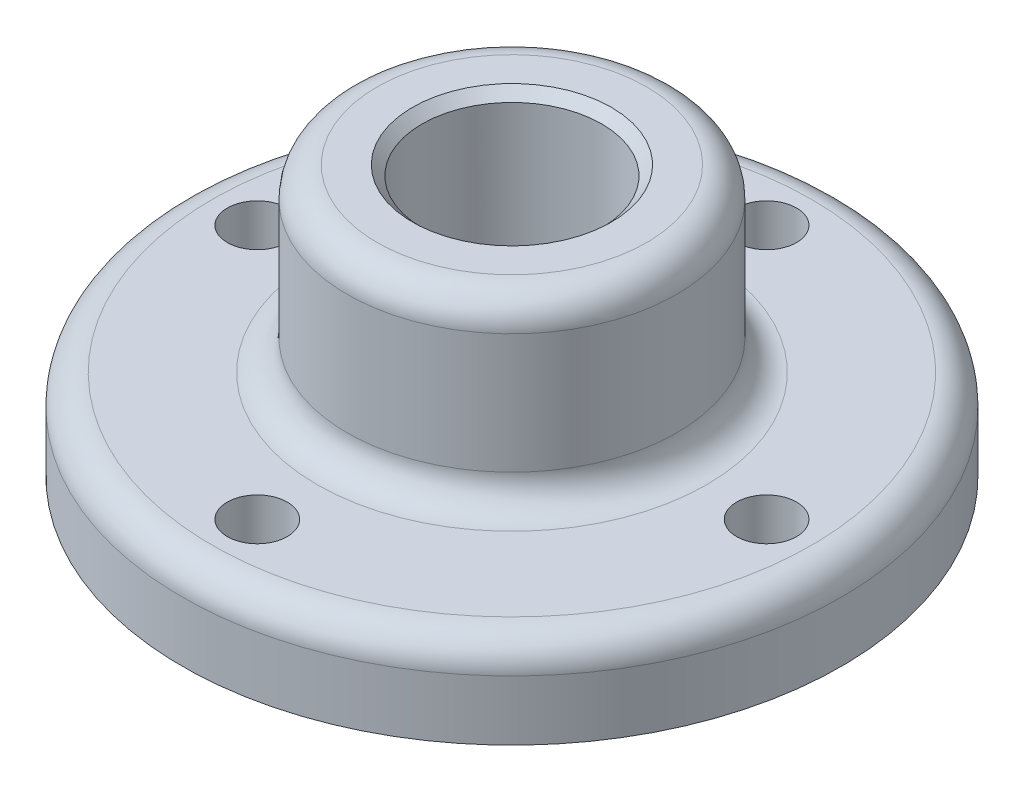
ISO-10303-21;
HEADER;
FILE_DESCRIPTION(('STEP AP214'),'2;1');
FILE_NAME('part.step','',(''),(''),'','','');
FILE_SCHEMA(('AUTOMOTIVE_DESIGN { 1 0 10303 214 1 1 1 1 }'));
ENDSEC;
DATA;
#1=APPLICATION_CONTEXT('core data for automotive mechanical design processes');
#2=APPLICATION_PROTOCOL_DEFINITION('international standard','automotive_design',2000,#1);
#3=PRODUCT_CONTEXT('',#1,'mechanical');
#4=PRODUCT('Part','Part','',(#3));
#5=PRODUCT_RELATED_PRODUCT_CATEGORY('part','',(#4));
#6=PRODUCT_DEFINITION_FORMATION('','',#4);
#7=PRODUCT_DEFINITION_CONTEXT('part definition',#1,'design');
#8=PRODUCT_DEFINITION('design','',#6,#7);
#9=PRODUCT_DEFINITION_SHAPE('','',#8);
#10=(LENGTH_UNIT() NAMED_UNIT(*) SI_UNIT(.MILLI.,.METRE.));
#11=(NAMED_UNIT(*) PLANE_ANGLE_UNIT() SI_UNIT($,.RADIAN.));
#12=(NAMED_UNIT(*) SI_UNIT($,.STERADIAN.) SOLID_ANGLE_UNIT());
#13=UNCERTAINTY_MEASURE_WITH_UNIT(LENGTH_MEASURE(1.E-05),#10,'distance_accuracy_value','');
#14=(GEOMETRIC_REPRESENTATION_CONTEXT(3) GLOBAL_UNCERTAINTY_ASSIGNED_CONTEXT((#13)) GLOBAL_UNIT_ASSIGNED_CONTEXT((#10,
#11,#12)) REPRESENTATION_CONTEXT('',''));
#15=CARTESIAN_POINT('',(0.,0.,0.));
#16=DIRECTION('',(0.,0.,1.));
#17=DIRECTION('',(1.,0.,0.));
#18=AXIS2_PLACEMENT_3D('',#15,#16,#17);
#19=CARTESIAN_POINT('',(0.,38.1,0.));
#20=DIRECTION('',(0.,-1.,0.));
#21=DIRECTION('',(0.,0.,-1.));
#22=AXIS2_PLACEMENT_3D('',#19,#20,#21);
#23=PLANE('',#22);
#24=CARTESIAN_POINT('',(0.,38.1,0.));
#25=DIRECTION('',(0.,-1.,0.));
#26=DIRECTION('',(0.,0.,-1.));
#27=AXIS2_PLACEMENT_3D('',#24,#25,#26);
#28=CIRCLE('',#27,21.082);
#29=CARTESIAN_POINT('',(0.,38.1,-21.082));
#30=VERTEX_POINT('',#29);
#31=EDGE_CURVE('E10',#30,#30,#28,.T.);
#32=ORIENTED_EDGE('',*,*,#31,.T.);
#33=EDGE_LOOP('',(#32));
#34=FACE_BOUND('',#33,.T.);
#35=CARTESIAN_POINT('',(0.,38.1,0.));
#36=DIRECTION('',(0.,-1.,0.));
#37=DIRECTION('',(0.,0.,-1.));
#38=AXIS2_PLACEMENT_3D('',#35,#36,#37);
#39=CIRCLE('',#38,28.575);
#40=CARTESIAN_POINT('',(0.,38.1,-28.575));
#41=VERTEX_POINT('',#40);
#42=EDGE_CURVE('E49',#41,#41,#39,.F.);
#43=ORIENTED_EDGE('',*,*,#42,.T.);
#44=EDGE_LOOP('',(#43));
#45=FACE_BOUND('',#44,.T.);
#46=ADVANCED_FACE('F37',(#34,#45),#23,.F.);
#47=CARTESIAN_POINT('',(0.,-19.05,0.));
#48=DIRECTION('',(0.,-1.,0.));
#49=DIRECTION('',(0.,0.,-1.));
#50=AXIS2_PLACEMENT_3D('',#47,#48,#49);
#51=PLANE('',#50);
#52=CARTESIAN_POINT('',(-53.975,-19.05,1.88452705264058E-13));
#53=DIRECTION('',(0.,1.,0.));
#54=DIRECTION('',(1.,0.,0.));
#55=AXIS2_PLACEMENT_3D('',#52,#53,#54);
#56=CIRCLE('',#55,6.35);
#57=CARTESIAN_POINT('',(-47.625,-19.05,1.66281798762404E-13));
#58=VERTEX_POINT('',#57);
#59=EDGE_CURVE('E80',#58,#58,#56,.T.);
#60=ORIENTED_EDGE('',*,*,#59,.T.);
#61=EDGE_LOOP('',(#60));
#62=FACE_BOUND('',#61,.T.);
#63=CARTESIAN_POINT('',(0.,-19.05,53.975));
#64=DIRECTION('',(0.,1.,0.));
#65=DIRECTION('',(0.,0.,-1.));
#66=AXIS2_PLACEMENT_3D('',#63,#64,#65);
#67=CIRCLE('',#66,6.35);
#68=CARTESIAN_POINT('',(0.,-19.05,47.625));
#69=VERTEX_POINT('',#68);
#70=EDGE_CURVE('E92',#69,#69,#67,.T.);
#71=ORIENTED_EDGE('',*,*,#70,.T.);
#72=EDGE_LOOP('',(#71));
#73=FACE_BOUND('',#72,.T.);
#74=CARTESIAN_POINT('',(53.975,-19.05,-5.65358115792174E-13));
#75=DIRECTION('',(0.,1.,0.));
#76=DIRECTION('',(-1.,0.,0.));
#77=AXIS2_PLACEMENT_3D('',#74,#75,#76);
#78=CIRCLE('',#77,6.35);
#79=CARTESIAN_POINT('',(47.625,-19.05,-4.98845396287213E-13));
#80=VERTEX_POINT('',#79);
#81=EDGE_CURVE('E86',#80,#80,#78,.T.);
#82=ORIENTED_EDGE('',*,*,#81,.T.);
#83=EDGE_LOOP('',(#82));
#84=FACE_BOUND('',#83,.T.);
#85=CARTESIAN_POINT('',(0.,-19.05,-53.975));
#86=DIRECTION('',(0.,1.,0.));
#87=DIRECTION('',(0.,0.,1.));
#88=AXIS2_PLACEMENT_3D('',#85,#86,#87);
#89=CIRCLE('',#88,6.35);
#90=CARTESIAN_POINT('',(0.,-19.05,-47.625));
#91=VERTEX_POINT('',#90);
#92=EDGE_CURVE('E76',#91,#91,#89,.T.);
#93=ORIENTED_EDGE('',*,*,#92,.T.);
#94=EDGE_LOOP('',(#93));
#95=FACE_BOUND('',#94,.T.);
#96=CARTESIAN_POINT('',(0.,-19.05,0.));
#97=DIRECTION('',(0.,1.,0.));
#98=DIRECTION('',(0.,0.,1.));
#99=AXIS2_PLACEMENT_3D('',#96,#97,#98);
#100=CIRCLE('',#99,19.05);
#101=CARTESIAN_POINT('',(0.,-19.05,19.05));
#102=VERTEX_POINT('',#101);
#103=EDGE_CURVE('E73',#102,#102,#100,.T.);
#104=ORIENTED_EDGE('',*,*,#103,.T.);
#105=EDGE_LOOP('',(#104));
#106=FACE_BOUND('',#105,.T.);
#107=CARTESIAN_POINT('',(0.,-19.05,0.));
#108=DIRECTION('',(0.,-1.,0.));
#109=DIRECTION('',(0.,0.,-1.));
#110=AXIS2_PLACEMENT_3D('',#107,#108,#109);
#111=CIRCLE('',#110,69.85);
#112=CARTESIAN_POINT('',(0.,-19.05,-69.85));
#113=VERTEX_POINT('',#112);
#114=EDGE_CURVE('E70',#113,#113,#111,.T.);
#115=ORIENTED_EDGE('',*,*,#114,.T.);
#116=EDGE_LOOP('',(#115));
#117=FACE_BOUND('',#116,.T.);
#118=ADVANCED_FACE('F101',(#62,#73,#84,#95,#106,#117),#51,.T.);
#119=CARTESIAN_POINT('',(0.,38.1,0.));
#120=DIRECTION('',(0.,-1.,0.));
#121=DIRECTION('',(0.,0.,-1.));
#122=AXIS2_PLACEMENT_3D('',#119,#120,#121);
#123=CYLINDRICAL_SURFACE('',#122,69.85);
#124=CARTESIAN_POINT('',(0.,-6.35,0.));
#125=DIRECTION('',(0.,-1.,0.));
#126=DIRECTION('',(0.,0.,-1.));
#127=AXIS2_PLACEMENT_3D('',#124,#125,#126);
#128=CIRCLE('',#127,69.85);
#129=CARTESIAN_POINT('',(0.,-6.35,-69.85));
#130=VERTEX_POINT('',#129);
#131=EDGE_CURVE('E53',#130,#130,#128,.T.);
#132=ORIENTED_EDGE('',*,*,#131,.T.);
#133=EDGE_LOOP('',(#132));
#134=FACE_BOUND('',#133,.T.);
#135=ORIENTED_EDGE('',*,*,#114,.F.);
#136=EDGE_LOOP('',(#135));
#137=FACE_BOUND('',#136,.T.);
#138=ADVANCED_FACE('F116',(#134,#137),#123,.T.);
#139=CARTESIAN_POINT('',(34.925,0.,0.));
#140=DIRECTION('',(0.,-1.,0.));
#141=DIRECTION('',(0.,0.,-1.));
#142=AXIS2_PLACEMENT_3D('',#139,#140,#141);
#143=PLANE('',#142);
#144=CARTESIAN_POINT('',(0.,0.,0.));
#145=DIRECTION('',(0.,-1.,0.));
#146=DIRECTION('',(0.,0.,-1.));
#147=AXIS2_PLACEMENT_3D('',#144,#145,#146);
#148=CIRCLE('',#147,41.275);
#149=CARTESIAN_POINT('',(0.,0.,-41.275));
#150=VERTEX_POINT('',#149);
#151=EDGE_CURVE('E64',#150,#150,#148,.T.);
#152=ORIENTED_EDGE('',*,*,#151,.T.);
#153=EDGE_LOOP('',(#152));
#154=FACE_BOUND('',#153,.T.);
#155=CARTESIAN_POINT('',(0.,0.,0.));
#156=DIRECTION('',(0.,-1.,0.));
#157=DIRECTION('',(0.,0.,-1.));
#158=AXIS2_PLACEMENT_3D('',#155,#156,#157);
#159=CIRCLE('',#158,63.5);
#160=CARTESIAN_POINT('',(0.,0.,-63.5));
#161=VERTEX_POINT('',#160);
#162=EDGE_CURVE('E67',#161,#161,#159,.F.);
#163=ORIENTED_EDGE('',*,*,#162,.T.);
#164=EDGE_LOOP('',(#163));
#165=FACE_BOUND('',#164,.T.);
#166=CARTESIAN_POINT('',(-53.975,0.,1.88452705264058E-13));
#167=DIRECTION('',(0.,1.,0.));
#168=DIRECTION('',(1.,0.,0.));
#169=AXIS2_PLACEMENT_3D('',#166,#167,#168);
#170=CIRCLE('',#169,6.35);
#171=CARTESIAN_POINT('',(-47.625,0.,1.66281798762404E-13));
#172=VERTEX_POINT('',#171);
#173=EDGE_CURVE('E95',#172,#172,#170,.T.);
#174=ORIENTED_EDGE('',*,*,#173,.F.);
#175=EDGE_LOOP('',(#174));
#176=FACE_BOUND('',#175,.T.);
#177=CARTESIAN_POINT('',(0.,0.,53.975));
#178=DIRECTION('',(0.,1.,0.));
#179=DIRECTION('',(0.,0.,-1.));
#180=AXIS2_PLACEMENT_3D('',#177,#178,#179);
#181=CIRCLE('',#180,6.35);
#182=CARTESIAN_POINT('',(0.,0.,47.625));
#183=VERTEX_POINT('',#182);
#184=EDGE_CURVE('E89',#183,#183,#181,.T.);
#185=ORIENTED_EDGE('',*,*,#184,.F.);
#186=EDGE_LOOP('',(#185));
#187=FACE_BOUND('',#186,.T.);
#188=CARTESIAN_POINT('',(53.975,0.,-5.65358115792174E-13));
#189=DIRECTION('',(0.,1.,0.));
#190=DIRECTION('',(-1.,0.,0.));
#191=AXIS2_PLACEMENT_3D('',#188,#189,#190);
#192=CIRCLE('',#191,6.35);
#193=CARTESIAN_POINT('',(47.625,0.,-4.98845396287213E-13));
#194=VERTEX_POINT('',#193);
#195=EDGE_CURVE('E83',#194,#194,#192,.T.);
#196=ORIENTED_EDGE('',*,*,#195,.F.);
#197=EDGE_LOOP('',(#196));
#198=FACE_BOUND('',#197,.T.);
#199=CARTESIAN_POINT('',(0.,0.,-53.975));
#200=DIRECTION('',(0.,1.,0.));
#201=DIRECTION('',(0.,0.,1.));
#202=AXIS2_PLACEMENT_3D('',#199,#200,#201);
#203=CIRCLE('',#202,6.35);
#204=CARTESIAN_POINT('',(0.,0.,-47.625));
#205=VERTEX_POINT('',#204);
#206=EDGE_CURVE('E77',#205,#205,#203,.T.);
#207=ORIENTED_EDGE('',*,*,#206,.F.);
#208=EDGE_LOOP('',(#207));
#209=FACE_BOUND('',#208,.T.);
#210=ADVANCED_FACE('F112',(#154,#165,#176,#187,#198,#209),#143,.F.);
#211=CARTESIAN_POINT('',(0.,38.1,0.));
#212=DIRECTION('',(0.,-1.,0.));
#213=DIRECTION('',(0.,0.,-1.));
#214=AXIS2_PLACEMENT_3D('',#211,#212,#213);
#215=CYLINDRICAL_SURFACE('',#214,34.925);
#216=CARTESIAN_POINT('',(0.,6.35,0.));
#217=DIRECTION('',(0.,-1.,0.));
#218=DIRECTION('',(0.,0.,-1.));
#219=AXIS2_PLACEMENT_3D('',#216,#217,#218);
#220=CIRCLE('',#219,34.925);
#221=CARTESIAN_POINT('',(0.,6.35,-34.925));
#222=VERTEX_POINT('',#221);
#223=EDGE_CURVE('E58',#222,#222,#220,.F.);
#224=ORIENTED_EDGE('',*,*,#223,.T.);
#225=EDGE_LOOP('',(#224));
#226=FACE_BOUND('',#225,.T.);
#227=CARTESIAN_POINT('',(0.,31.75,0.));
#228=DIRECTION('',(0.,-1.,0.));
#229=DIRECTION('',(0.,0.,-1.));
#230=AXIS2_PLACEMENT_3D('',#227,#228,#229);
#231=CIRCLE('',#230,34.925);
#232=CARTESIAN_POINT('',(0.,31.75,-34.925));
#233=VERTEX_POINT('',#232);
#234=EDGE_CURVE('E61',#233,#233,#231,.T.);
#235=ORIENTED_EDGE('',*,*,#234,.T.);
#236=EDGE_LOOP('',(#235));
#237=FACE_BOUND('',#236,.T.);
#238=ADVANCED_FACE('F115',(#226,#237),#215,.T.);
#239=CARTESIAN_POINT('',(0.,-19.05,0.));
#240=DIRECTION('',(0.,1.,0.));
#241=DIRECTION('',(0.,0.,1.));
#242=AXIS2_PLACEMENT_3D('',#239,#240,#241);
#243=CYLINDRICAL_SURFACE('',#242,19.05);
#244=CARTESIAN_POINT('',(0.,36.068,0.));
#245=DIRECTION('',(0.,-1.,0.));
#246=DIRECTION('',(0.,0.,-1.));
#247=AXIS2_PLACEMENT_3D('',#244,#245,#246);
#248=CIRCLE('',#247,19.05);
#249=CARTESIAN_POINT('',(0.,36.068,-19.05));
#250=VERTEX_POINT('',#249);
#251=EDGE_CURVE('E45',#250,#250,#248,.F.);
#252=ORIENTED_EDGE('',*,*,#251,.T.);
#253=EDGE_LOOP('',(#252));
#254=FACE_BOUND('',#253,.T.);
#255=ORIENTED_EDGE('',*,*,#103,.F.);
#256=EDGE_LOOP('',(#255));
#257=FACE_BOUND('',#256,.T.);
#258=ADVANCED_FACE('F128',(#254,#257),#243,.F.);
#259=CARTESIAN_POINT('',(0.,-19.05,-53.975));
#260=DIRECTION('',(0.,1.,0.));
#261=DIRECTION('',(0.,0.,1.));
#262=AXIS2_PLACEMENT_3D('',#259,#260,#261);
#263=CYLINDRICAL_SURFACE('',#262,6.35);
#264=ORIENTED_EDGE('',*,*,#92,.F.);
#265=EDGE_LOOP('',(#264));
#266=FACE_BOUND('',#265,.T.);
#267=ORIENTED_EDGE('',*,*,#206,.T.);
#268=EDGE_LOOP('',(#267));
#269=FACE_BOUND('',#268,.T.);
#270=ADVANCED_FACE('F125',(#266,#269),#263,.F.);
#271=CARTESIAN_POINT('',(53.975,-19.05,-5.65358115792174E-13));
#272=DIRECTION('',(0.,1.,0.));
#273=DIRECTION('',(0.,0.,1.));
#274=AXIS2_PLACEMENT_3D('',#271,#272,#273);
#275=CYLINDRICAL_SURFACE('',#274,6.35);
#276=ORIENTED_EDGE('',*,*,#81,.F.);
#277=EDGE_LOOP('',(#276));
#278=FACE_BOUND('',#277,.T.);
#279=ORIENTED_EDGE('',*,*,#195,.T.);
#280=EDGE_LOOP('',(#279));
#281=FACE_BOUND('',#280,.T.);
#282=ADVANCED_FACE('F127',(#278,#281),#275,.F.);
#283=CARTESIAN_POINT('',(0.,-19.05,53.975));
#284=DIRECTION('',(0.,1.,0.));
#285=DIRECTION('',(0.,0.,1.));
#286=AXIS2_PLACEMENT_3D('',#283,#284,#285);
#287=CYLINDRICAL_SURFACE('',#286,6.35);
#288=ORIENTED_EDGE('',*,*,#70,.F.);
#289=EDGE_LOOP('',(#288));
#290=FACE_BOUND('',#289,.T.);
#291=ORIENTED_EDGE('',*,*,#184,.T.);
#292=EDGE_LOOP('',(#291));
#293=FACE_BOUND('',#292,.T.);
#294=ADVANCED_FACE('F108',(#290,#293),#287,.F.);
#295=CARTESIAN_POINT('',(-53.975,-19.05,1.88452705264058E-13));
#296=DIRECTION('',(0.,1.,0.));
#297=DIRECTION('',(0.,0.,1.));
#298=AXIS2_PLACEMENT_3D('',#295,#296,#297);
#299=CYLINDRICAL_SURFACE('',#298,6.35);
#300=ORIENTED_EDGE('',*,*,#59,.F.);
#301=EDGE_LOOP('',(#300));
#302=FACE_BOUND('',#301,.T.);
#303=ORIENTED_EDGE('',*,*,#173,.T.);
#304=EDGE_LOOP('',(#303));
#305=FACE_BOUND('',#304,.T.);
#306=ADVANCED_FACE('F104',(#302,#305),#299,.F.);
#307=CARTESIAN_POINT('',(0.,6.35,0.));
#308=DIRECTION('',(0.,-1.,0.));
#309=DIRECTION('',(0.,0.,-1.));
#310=AXIS2_PLACEMENT_3D('',#307,#308,#309);
#311=TOROIDAL_SURFACE('',#310,41.275,6.35);
#312=ORIENTED_EDGE('',*,*,#223,.F.);
#313=EDGE_LOOP('',(#312));
#314=FACE_BOUND('',#313,.T.);
#315=ORIENTED_EDGE('',*,*,#151,.F.);
#316=EDGE_LOOP('',(#315));
#317=FACE_BOUND('',#316,.T.);
#318=ADVANCED_FACE('F107',(#314,#317),#311,.F.);
#319=CARTESIAN_POINT('',(0.,-6.35,0.));
#320=DIRECTION('',(0.,-1.,0.));
#321=DIRECTION('',(0.,0.,-1.));
#322=AXIS2_PLACEMENT_3D('',#319,#320,#321);
#323=TOROIDAL_SURFACE('',#322,63.5,6.35);
#324=ORIENTED_EDGE('',*,*,#162,.F.);
#325=EDGE_LOOP('',(#324));
#326=FACE_BOUND('',#325,.T.);
#327=ORIENTED_EDGE('',*,*,#131,.F.);
#328=EDGE_LOOP('',(#327));
#329=FACE_BOUND('',#328,.T.);
#330=ADVANCED_FACE('F150',(#326,#329),#323,.T.);
#331=CARTESIAN_POINT('',(0.,31.75,0.));
#332=DIRECTION('',(0.,-1.,0.));
#333=DIRECTION('',(0.,0.,-1.));
#334=AXIS2_PLACEMENT_3D('',#331,#332,#333);
#335=TOROIDAL_SURFACE('',#334,28.575,6.35);
#336=ORIENTED_EDGE('',*,*,#42,.F.);
#337=EDGE_LOOP('',(#336));
#338=FACE_BOUND('',#337,.T.);
#339=ORIENTED_EDGE('',*,*,#234,.F.);
#340=EDGE_LOOP('',(#339));
#341=FACE_BOUND('',#340,.T.);
#342=ADVANCED_FACE('F153',(#338,#341),#335,.T.);
#343=CARTESIAN_POINT('',(0.,36.068,0.));
#344=DIRECTION('',(0.,1.,0.));
#345=DIRECTION('',(0.,0.,1.));
#346=AXIS2_PLACEMENT_3D('',#343,#344,#345);
#347=CONICAL_SURFACE('',#346,19.05,0.785398163397451);
#348=ORIENTED_EDGE('',*,*,#31,.F.);
#349=EDGE_LOOP('',(#348));
#350=FACE_BOUND('',#349,.T.);
#351=ORIENTED_EDGE('',*,*,#251,.F.);
#352=EDGE_LOOP('',(#351));
#353=FACE_BOUND('',#352,.T.);
#354=ADVANCED_FACE('F40',(#350,#353),#347,.F.);
#355=CLOSED_SHELL('',(#46,#118,#138,#210,#238,#258,#270,#282,#294,#306,#318,#330,#342,#354));
#356=MANIFOLD_SOLID_BREP('B2',#355);
#357=ADVANCED_BREP_SHAPE_REPRESENTATION('',(#18,#356),#14);
#358=SHAPE_DEFINITION_REPRESENTATION(#9,#357);
ENDSEC;
END-ISO-10303-21;
